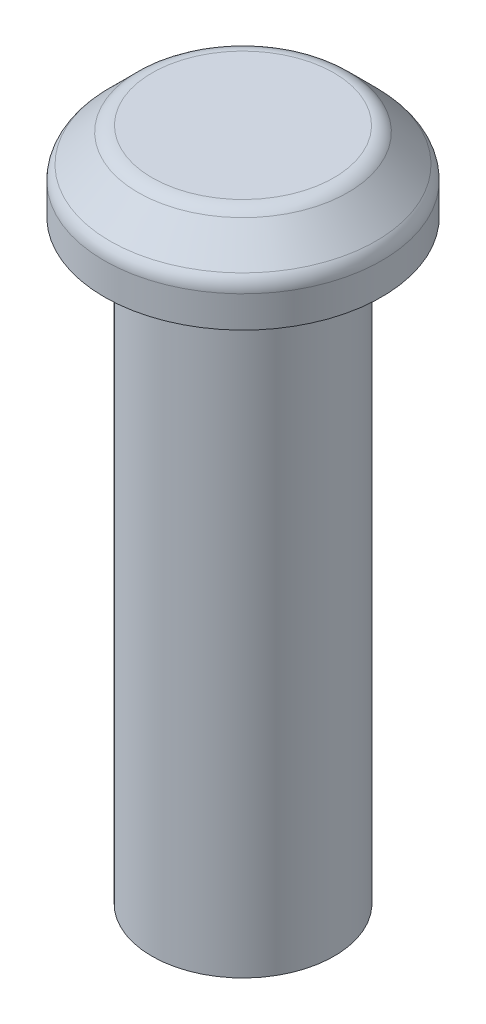
ISO-10303-21;
HEADER;
FILE_DESCRIPTION(('STEP AP214'),'2;1');
FILE_NAME('part.step','',(''),(''),'','','');
FILE_SCHEMA(('AUTOMOTIVE_DESIGN { 1 0 10303 214 1 1 1 1 }'));
ENDSEC;
DATA;
#1=APPLICATION_CONTEXT('core data for automotive mechanical design processes');
#2=APPLICATION_PROTOCOL_DEFINITION('international standard','automotive_design',2000,#1);
#3=PRODUCT_CONTEXT('',#1,'mechanical');
#4=PRODUCT('Part','Part','',(#3));
#5=PRODUCT_RELATED_PRODUCT_CATEGORY('part','',(#4));
#6=PRODUCT_DEFINITION_FORMATION('','',#4);
#7=PRODUCT_DEFINITION_CONTEXT('part definition',#1,'design');
#8=PRODUCT_DEFINITION('design','',#6,#7);
#9=PRODUCT_DEFINITION_SHAPE('','',#8);
#10=(LENGTH_UNIT() NAMED_UNIT(*) SI_UNIT(.MILLI.,.METRE.));
#11=(NAMED_UNIT(*) PLANE_ANGLE_UNIT() SI_UNIT($,.RADIAN.));
#12=(NAMED_UNIT(*) SI_UNIT($,.STERADIAN.) SOLID_ANGLE_UNIT());
#13=UNCERTAINTY_MEASURE_WITH_UNIT(LENGTH_MEASURE(1.E-05),#10,'distance_accuracy_value','');
#14=(GEOMETRIC_REPRESENTATION_CONTEXT(3) GLOBAL_UNCERTAINTY_ASSIGNED_CONTEXT((#13)) GLOBAL_UNIT_ASSIGNED_CONTEXT((#10,
#11,#12)) REPRESENTATION_CONTEXT('',''));
#15=CARTESIAN_POINT('',(0.,0.,0.));
#16=DIRECTION('',(0.,0.,1.));
#17=DIRECTION('',(1.,0.,0.));
#18=AXIS2_PLACEMENT_3D('',#15,#16,#17);
#19=CARTESIAN_POINT('',(0.,15.,0.));
#20=DIRECTION('',(0.,-1.,0.));
#21=DIRECTION('',(0.,0.,-1.));
#22=AXIS2_PLACEMENT_3D('',#19,#20,#21);
#23=CYLINDRICAL_SURFACE('',#22,2.3);
#24=CARTESIAN_POINT('',(0.,15.,0.));
#25=DIRECTION('',(0.,1.,0.));
#26=DIRECTION('',(0.,0.,1.));
#27=AXIS2_PLACEMENT_3D('',#24,#25,#26);
#28=CIRCLE('',#27,2.3);
#29=CARTESIAN_POINT('',(0.,15.,2.3));
#30=VERTEX_POINT('',#29);
#31=EDGE_CURVE('E67',#30,#30,#28,.T.);
#32=ORIENTED_EDGE('',*,*,#31,.F.);
#33=EDGE_LOOP('',(#32));
#34=FACE_BOUND('',#33,.T.);
#35=CARTESIAN_POINT('',(0.,0.,0.));
#36=DIRECTION('',(0.,1.,0.));
#37=DIRECTION('',(0.,0.,1.));
#38=AXIS2_PLACEMENT_3D('',#35,#36,#37);
#39=CIRCLE('',#38,2.3);
#40=CARTESIAN_POINT('',(0.,0.,2.3));
#41=VERTEX_POINT('',#40);
#42=EDGE_CURVE('E68',#41,#41,#39,.T.);
#43=ORIENTED_EDGE('',*,*,#42,.T.);
#44=EDGE_LOOP('',(#43));
#45=FACE_BOUND('',#44,.T.);
#46=ADVANCED_FACE('F43',(#34,#45),#23,.T.);
#47=CARTESIAN_POINT('',(0.,0.,0.));
#48=DIRECTION('',(0.,1.,0.));
#49=DIRECTION('',(0.,0.,1.));
#50=AXIS2_PLACEMENT_3D('',#47,#48,#49);
#51=PLANE('',#50);
#52=ORIENTED_EDGE('',*,*,#42,.F.);
#53=EDGE_LOOP('',(#52));
#54=FACE_BOUND('',#53,.T.);
#55=ADVANCED_FACE('F98',(#54),#51,.F.);
#56=CARTESIAN_POINT('',(0.,17.,0.));
#57=DIRECTION('',(0.,-1.,0.));
#58=DIRECTION('',(0.,0.,-1.));
#59=AXIS2_PLACEMENT_3D('',#56,#57,#58);
#60=CYLINDRICAL_SURFACE('',#59,3.5);
#61=CARTESIAN_POINT('',(0.,15.7928932188134,0.));
#62=DIRECTION('',(0.,1.,0.));
#63=DIRECTION('',(0.,0.,1.));
#64=AXIS2_PLACEMENT_3D('',#61,#62,#63);
#65=CIRCLE('',#64,3.5);
#66=CARTESIAN_POINT('',(0.,15.7928932188134,3.5));
#67=VERTEX_POINT('',#66);
#68=EDGE_CURVE('E10',#67,#67,#65,.F.);
#69=ORIENTED_EDGE('',*,*,#68,.T.);
#70=EDGE_LOOP('',(#69));
#71=FACE_BOUND('',#70,.T.);
#72=CARTESIAN_POINT('',(0.,15.,0.));
#73=DIRECTION('',(0.,1.,0.));
#74=DIRECTION('',(0.,0.,1.));
#75=AXIS2_PLACEMENT_3D('',#72,#73,#74);
#76=CIRCLE('',#75,3.5);
#77=CARTESIAN_POINT('',(0.,15.,3.5));
#78=VERTEX_POINT('',#77);
#79=EDGE_CURVE('E72',#78,#78,#76,.T.);
#80=ORIENTED_EDGE('',*,*,#79,.T.);
#81=EDGE_LOOP('',(#80));
#82=FACE_BOUND('',#81,.T.);
#83=ADVANCED_FACE('F80',(#71,#82),#60,.T.);
#84=CARTESIAN_POINT('',(0.,17.,0.));
#85=DIRECTION('',(0.,1.,0.));
#86=DIRECTION('',(0.,0.,1.));
#87=AXIS2_PLACEMENT_3D('',#84,#85,#86);
#88=PLANE('',#87);
#89=CARTESIAN_POINT('',(0.,17.,0.));
#90=DIRECTION('',(0.,1.,0.));
#91=DIRECTION('',(0.,0.,1.));
#92=AXIS2_PLACEMENT_3D('',#89,#90,#91);
#93=CIRCLE('',#92,2.29289321881345);
#94=CARTESIAN_POINT('',(0.,17.,2.29289321881345));
#95=VERTEX_POINT('',#94);
#96=EDGE_CURVE('E61',#95,#95,#93,.T.);
#97=ORIENTED_EDGE('',*,*,#96,.T.);
#98=EDGE_LOOP('',(#97));
#99=FACE_BOUND('',#98,.T.);
#100=ADVANCED_FACE('F85',(#99),#88,.T.);
#101=CARTESIAN_POINT('',(0.,15.,0.));
#102=DIRECTION('',(0.,1.,0.));
#103=DIRECTION('',(0.,0.,1.));
#104=AXIS2_PLACEMENT_3D('',#101,#102,#103);
#105=PLANE('',#104);
#106=ORIENTED_EDGE('',*,*,#31,.T.);
#107=EDGE_LOOP('',(#106));
#108=FACE_BOUND('',#107,.T.);
#109=ORIENTED_EDGE('',*,*,#79,.F.);
#110=EDGE_LOOP('',(#109));
#111=FACE_BOUND('',#110,.T.);
#112=ADVANCED_FACE('F82',(#108,#111),#105,.F.);
#113=CARTESIAN_POINT('',(0.,17.,0.));
#114=DIRECTION('',(0.,-1.,0.));
#115=DIRECTION('',(0.,0.,-1.));
#116=AXIS2_PLACEMENT_3D('',#113,#114,#115);
#117=CONICAL_SURFACE('',#116,2.5,0.785398163397446);
#118=CARTESIAN_POINT('',(0.,16.8535533905933,0.));
#119=DIRECTION('',(0.,1.,0.));
#120=DIRECTION('',(0.,0.,1.));
#121=AXIS2_PLACEMENT_3D('',#118,#119,#120);
#122=CIRCLE('',#121,2.64644660940673);
#123=CARTESIAN_POINT('',(0.,16.8535533905933,2.64644660940673));
#124=VERTEX_POINT('',#123);
#125=EDGE_CURVE('E51',#124,#124,#122,.F.);
#126=ORIENTED_EDGE('',*,*,#125,.T.);
#127=EDGE_LOOP('',(#126));
#128=FACE_BOUND('',#127,.T.);
#129=CARTESIAN_POINT('',(0.,16.1464466094067,0.));
#130=DIRECTION('',(0.,-1.,0.));
#131=DIRECTION('',(0.,0.,-1.));
#132=AXIS2_PLACEMENT_3D('',#129,#130,#131);
#133=CIRCLE('',#132,3.35355339059328);
#134=CARTESIAN_POINT('',(0.,16.1464466094067,-3.35355339059328));
#135=VERTEX_POINT('',#134);
#136=EDGE_CURVE('E56',#135,#135,#133,.F.);
#137=ORIENTED_EDGE('',*,*,#136,.T.);
#138=EDGE_LOOP('',(#137));
#139=FACE_BOUND('',#138,.T.);
#140=ADVANCED_FACE('F84',(#128,#139),#117,.T.);
#141=CARTESIAN_POINT('',(0.,16.5,0.));
#142=DIRECTION('',(0.,1.,0.));
#143=DIRECTION('',(0.,0.,1.));
#144=AXIS2_PLACEMENT_3D('',#141,#142,#143);
#145=TOROIDAL_SURFACE('',#144,2.29289321881345,0.5);
#146=ORIENTED_EDGE('',*,*,#125,.F.);
#147=EDGE_LOOP('',(#146));
#148=FACE_BOUND('',#147,.T.);
#149=ORIENTED_EDGE('',*,*,#96,.F.);
#150=EDGE_LOOP('',(#149));
#151=FACE_BOUND('',#150,.T.);
#152=ADVANCED_FACE('F92',(#148,#151),#145,.T.);
#153=CARTESIAN_POINT('',(0.,15.7928932188134,0.));
#154=DIRECTION('',(0.,1.,0.));
#155=DIRECTION('',(0.,0.,1.));
#156=AXIS2_PLACEMENT_3D('',#153,#154,#155);
#157=TOROIDAL_SURFACE('',#156,3.,0.5);
#158=ORIENTED_EDGE('',*,*,#136,.F.);
#159=EDGE_LOOP('',(#158));
#160=FACE_BOUND('',#159,.T.);
#161=ORIENTED_EDGE('',*,*,#68,.F.);
#162=EDGE_LOOP('',(#161));
#163=FACE_BOUND('',#162,.T.);
#164=ADVANCED_FACE('F45',(#160,#163),#157,.T.);
#165=CLOSED_SHELL('',(#46,#55,#83,#100,#112,#140,#152,#164));
#166=MANIFOLD_SOLID_BREP('B2',#165);
#167=ADVANCED_BREP_SHAPE_REPRESENTATION('',(#18,#166),#14);
#168=SHAPE_DEFINITION_REPRESENTATION(#9,#167);
ENDSEC;
END-ISO-10303-21;
